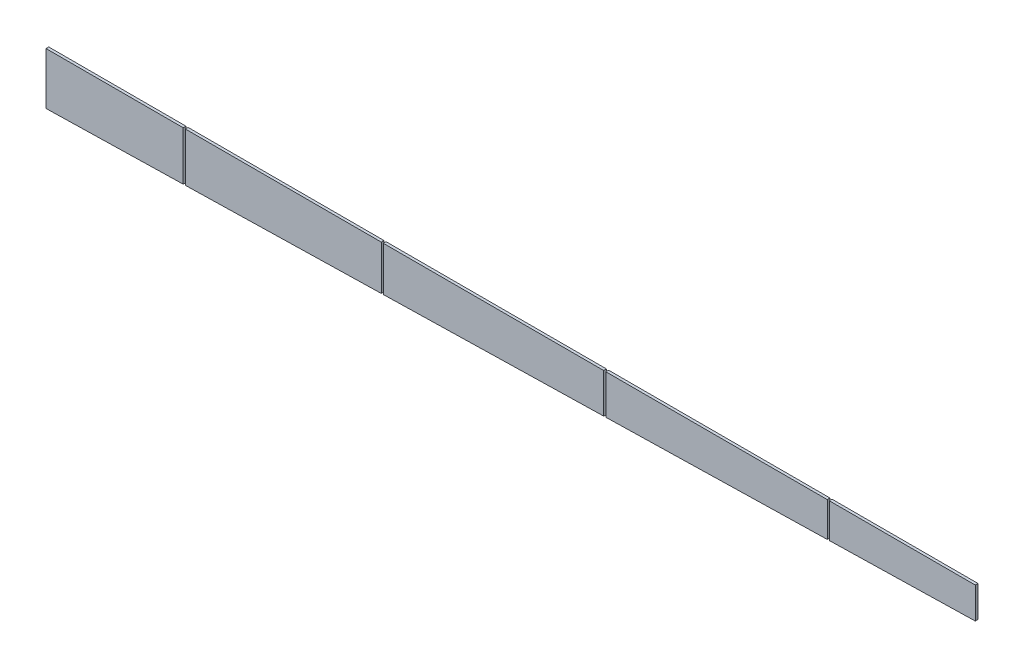
ISO-10303-21;
HEADER;
FILE_DESCRIPTION(('STEP AP214'),'2;1');
FILE_NAME('part.step','',(''),(''),'','','');
FILE_SCHEMA(('AUTOMOTIVE_DESIGN { 1 0 10303 214 1 1 1 1 }'));
ENDSEC;
DATA;
#1=APPLICATION_CONTEXT('core data for automotive mechanical design processes');
#2=APPLICATION_PROTOCOL_DEFINITION('international standard','automotive_design',2000,#1);
#3=PRODUCT_CONTEXT('',#1,'mechanical');
#4=PRODUCT('Part','Part','',(#3));
#5=PRODUCT_RELATED_PRODUCT_CATEGORY('part','',(#4));
#6=PRODUCT_DEFINITION_FORMATION('','',#4);
#7=PRODUCT_DEFINITION_CONTEXT('part definition',#1,'design');
#8=PRODUCT_DEFINITION('design','',#6,#7);
#9=PRODUCT_DEFINITION_SHAPE('','',#8);
#10=(LENGTH_UNIT() NAMED_UNIT(*) SI_UNIT(.MILLI.,.METRE.));
#11=(NAMED_UNIT(*) PLANE_ANGLE_UNIT() SI_UNIT($,.RADIAN.));
#12=(NAMED_UNIT(*) SI_UNIT($,.STERADIAN.) SOLID_ANGLE_UNIT());
#13=UNCERTAINTY_MEASURE_WITH_UNIT(LENGTH_MEASURE(1.E-05),#10,'distance_accuracy_value','');
#14=(GEOMETRIC_REPRESENTATION_CONTEXT(3) GLOBAL_UNCERTAINTY_ASSIGNED_CONTEXT((#13)) GLOBAL_UNIT_ASSIGNED_CONTEXT((#10,
#11,#12)) REPRESENTATION_CONTEXT('',''));
#15=CARTESIAN_POINT('',(0.,0.,0.));
#16=DIRECTION('',(0.,0.,1.));
#17=DIRECTION('',(1.,0.,0.));
#18=AXIS2_PLACEMENT_3D('',#15,#16,#17);
#19=CARTESIAN_POINT('',(1123.74428319064,361.818846768345,2.));
#20=DIRECTION('',(0.,-1.,0.));
#21=DIRECTION('',(0.,0.,-1.));
#22=AXIS2_PLACEMENT_3D('',#19,#20,#21);
#23=PLANE('',#22);
#24=DIRECTION('',(-1.,0.,0.));
#25=VECTOR('',#24,1.);
#26=CARTESIAN_POINT('',(1123.74428319064,361.818846768345,0.));
#27=LINE('',#26,#25);
#28=CARTESIAN_POINT('',(1123.74428319064,361.818846768345,0.));
#29=VERTEX_POINT('',#28);
#30=CARTESIAN_POINT('',(1016.94159784429,361.818846768345,0.));
#31=VERTEX_POINT('',#30);
#32=EDGE_CURVE('E109',#29,#31,#27,.T.);
#33=ORIENTED_EDGE('',*,*,#32,.T.);
#34=DIRECTION('',(0.,0.,-1.));
#35=VECTOR('',#34,1.);
#36=CARTESIAN_POINT('',(1016.94159784429,361.818846768345,2.));
#37=LINE('',#36,#35);
#38=CARTESIAN_POINT('',(1016.94159784429,361.818846768345,2.));
#39=VERTEX_POINT('',#38);
#40=EDGE_CURVE('E12',#39,#31,#37,.T.);
#41=ORIENTED_EDGE('',*,*,#40,.F.);
#42=DIRECTION('',(-1.,0.,0.));
#43=VECTOR('',#42,1.);
#44=CARTESIAN_POINT('',(1123.74428319064,361.818846768345,2.));
#45=LINE('',#44,#43);
#46=CARTESIAN_POINT('',(1123.74428319064,361.818846768345,2.));
#47=VERTEX_POINT('',#46);
#48=EDGE_CURVE('E97',#47,#39,#45,.T.);
#49=ORIENTED_EDGE('',*,*,#48,.F.);
#50=DIRECTION('',(0.,0.,-1.));
#51=VECTOR('',#50,1.);
#52=CARTESIAN_POINT('',(1123.74428319064,361.818846768345,2.));
#53=LINE('',#52,#51);
#54=EDGE_CURVE('E105',#47,#29,#53,.T.);
#55=ORIENTED_EDGE('',*,*,#54,.T.);
#56=EDGE_LOOP('',(#33,#41,#49,#55));
#57=FACE_BOUND('',#56,.T.);
#58=ADVANCED_FACE('F46',(#57),#23,.F.);
#59=CARTESIAN_POINT('',(1016.94159784429,361.818846768345,2.));
#60=DIRECTION('',(1.,0.,0.));
#61=DIRECTION('',(0.,0.,-1.));
#62=AXIS2_PLACEMENT_3D('',#59,#60,#61);
#63=PLANE('',#62);
#64=DIRECTION('',(0.,-1.,0.));
#65=VECTOR('',#64,1.);
#66=CARTESIAN_POINT('',(1016.94159784429,361.818846768345,0.));
#67=LINE('',#66,#65);
#68=CARTESIAN_POINT('',(1016.94159784429,336.598082630978,0.));
#69=VERTEX_POINT('',#68);
#70=EDGE_CURVE('E101',#31,#69,#67,.T.);
#71=ORIENTED_EDGE('',*,*,#70,.T.);
#72=DIRECTION('',(0.,0.,-1.));
#73=VECTOR('',#72,1.);
#74=CARTESIAN_POINT('',(1016.94159784429,336.598082630978,2.));
#75=LINE('',#74,#73);
#76=CARTESIAN_POINT('',(1016.94159784429,336.598082630978,2.));
#77=VERTEX_POINT('',#76);
#78=EDGE_CURVE('E54',#77,#69,#75,.T.);
#79=ORIENTED_EDGE('',*,*,#78,.F.);
#80=DIRECTION('',(0.,-1.,0.));
#81=VECTOR('',#80,1.);
#82=CARTESIAN_POINT('',(1016.94159784429,361.818846768345,2.));
#83=LINE('',#82,#81);
#84=EDGE_CURVE('E92',#39,#77,#83,.T.);
#85=ORIENTED_EDGE('',*,*,#84,.F.);
#86=ORIENTED_EDGE('',*,*,#40,.T.);
#87=EDGE_LOOP('',(#71,#79,#85,#86));
#88=FACE_BOUND('',#87,.T.);
#89=ADVANCED_FACE('F100',(#88),#63,.F.);
#90=CARTESIAN_POINT('',(1016.94159784429,336.598082630978,2.));
#91=DIRECTION('',(-0.0223180913536274,0.999750920378837,0.));
#92=DIRECTION('',(-0.999750920378837,-0.0223180913536274,0.));
#93=AXIS2_PLACEMENT_3D('',#90,#91,#92);
#94=PLANE('',#93);
#95=DIRECTION('',(0.999750920378837,0.0223180913536274,0.));
#96=VECTOR('',#95,1.);
#97=CARTESIAN_POINT('',(1016.94159784429,336.598082630978,0.));
#98=LINE('',#97,#96);
#99=CARTESIAN_POINT('',(1123.74428319064,338.982308581447,0.));
#100=VERTEX_POINT('',#99);
#101=EDGE_CURVE('E79',#69,#100,#98,.T.);
#102=ORIENTED_EDGE('',*,*,#101,.T.);
#103=DIRECTION('',(0.,0.,-1.));
#104=VECTOR('',#103,1.);
#105=CARTESIAN_POINT('',(1123.74428319064,338.982308581447,2.));
#106=LINE('',#105,#104);
#107=CARTESIAN_POINT('',(1123.74428319064,338.982308581447,2.));
#108=VERTEX_POINT('',#107);
#109=EDGE_CURVE('E102',#108,#100,#106,.T.);
#110=ORIENTED_EDGE('',*,*,#109,.F.);
#111=DIRECTION('',(0.999750920378837,0.0223180913536274,0.));
#112=VECTOR('',#111,1.);
#113=CARTESIAN_POINT('',(1016.94159784429,336.598082630978,2.));
#114=LINE('',#113,#112);
#115=EDGE_CURVE('E95',#77,#108,#114,.T.);
#116=ORIENTED_EDGE('',*,*,#115,.F.);
#117=ORIENTED_EDGE('',*,*,#78,.T.);
#118=EDGE_LOOP('',(#102,#110,#116,#117));
#119=FACE_BOUND('',#118,.T.);
#120=ADVANCED_FACE('F103',(#119),#94,.F.);
#121=CARTESIAN_POINT('',(1123.74428319064,338.982308581447,2.));
#122=DIRECTION('',(-1.,0.,0.));
#123=DIRECTION('',(0.,0.,1.));
#124=AXIS2_PLACEMENT_3D('',#121,#122,#123);
#125=PLANE('',#124);
#126=DIRECTION('',(0.,1.,0.));
#127=VECTOR('',#126,1.);
#128=CARTESIAN_POINT('',(1123.74428319064,338.982308581447,0.));
#129=LINE('',#128,#127);
#130=EDGE_CURVE('E85',#100,#29,#129,.T.);
#131=ORIENTED_EDGE('',*,*,#130,.T.);
#132=ORIENTED_EDGE('',*,*,#54,.F.);
#133=DIRECTION('',(0.,1.,0.));
#134=VECTOR('',#133,1.);
#135=CARTESIAN_POINT('',(1123.74428319064,338.982308581447,2.));
#136=LINE('',#135,#134);
#137=EDGE_CURVE('E62',#108,#47,#136,.T.);
#138=ORIENTED_EDGE('',*,*,#137,.F.);
#139=ORIENTED_EDGE('',*,*,#109,.T.);
#140=EDGE_LOOP('',(#131,#132,#138,#139));
#141=FACE_BOUND('',#140,.T.);
#142=ADVANCED_FACE('F116',(#141),#125,.F.);
#143=CARTESIAN_POINT('',(0.,0.,2.));
#144=DIRECTION('',(0.,0.,1.));
#145=DIRECTION('',(1.,0.,0.));
#146=AXIS2_PLACEMENT_3D('',#143,#144,#145);
#147=PLANE('',#146);
#148=ORIENTED_EDGE('',*,*,#48,.T.);
#149=ORIENTED_EDGE('',*,*,#84,.T.);
#150=ORIENTED_EDGE('',*,*,#115,.T.);
#151=ORIENTED_EDGE('',*,*,#137,.T.);
#152=EDGE_LOOP('',(#148,#149,#150,#151));
#153=FACE_BOUND('',#152,.T.);
#154=ADVANCED_FACE('F93',(#153),#147,.T.);
#155=CARTESIAN_POINT('',(0.,0.,0.));
#156=DIRECTION('',(0.,0.,1.));
#157=DIRECTION('',(1.,0.,0.));
#158=AXIS2_PLACEMENT_3D('',#155,#156,#157);
#159=PLANE('',#158);
#160=ORIENTED_EDGE('',*,*,#32,.F.);
#161=ORIENTED_EDGE('',*,*,#130,.F.);
#162=ORIENTED_EDGE('',*,*,#101,.F.);
#163=ORIENTED_EDGE('',*,*,#70,.F.);
#164=EDGE_LOOP('',(#160,#161,#162,#163));
#165=FACE_BOUND('',#164,.T.);
#166=ADVANCED_FACE('F119',(#165),#159,.F.);
#167=CLOSED_SHELL('',(#58,#89,#120,#142,#154,#166));
#168=MANIFOLD_SOLID_BREP('B2',#167);
#169=CARTESIAN_POINT('',(1015.44159784429,361.818846768345,2.));
#170=DIRECTION('',(0.,-1.,0.));
#171=DIRECTION('',(0.,0.,-1.));
#172=AXIS2_PLACEMENT_3D('',#169,#170,#171);
#173=PLANE('',#172);
#174=DIRECTION('',(-1.,0.,0.));
#175=VECTOR('',#174,1.);
#176=CARTESIAN_POINT('',(1015.44159784429,361.818846768345,0.));
#177=LINE('',#176,#175);
#178=CARTESIAN_POINT('',(1015.44159784429,361.818846768345,0.));
#179=VERTEX_POINT('',#178);
#180=CARTESIAN_POINT('',(853.383517511903,361.818846768345,0.));
#181=VERTEX_POINT('',#180);
#182=EDGE_CURVE('E243',#179,#181,#177,.T.);
#183=ORIENTED_EDGE('',*,*,#182,.T.);
#184=DIRECTION('',(0.,0.,-1.));
#185=VECTOR('',#184,1.);
#186=CARTESIAN_POINT('',(853.383517511903,361.818846768345,2.));
#187=LINE('',#186,#185);
#188=CARTESIAN_POINT('',(853.383517511903,361.818846768345,2.));
#189=VERTEX_POINT('',#188);
#190=EDGE_CURVE('E44',#189,#181,#187,.T.);
#191=ORIENTED_EDGE('',*,*,#190,.F.);
#192=DIRECTION('',(-1.,0.,0.));
#193=VECTOR('',#192,1.);
#194=CARTESIAN_POINT('',(1015.44159784429,361.818846768345,2.));
#195=LINE('',#194,#193);
#196=CARTESIAN_POINT('',(1015.44159784429,361.818846768345,2.));
#197=VERTEX_POINT('',#196);
#198=EDGE_CURVE('E231',#197,#189,#195,.T.);
#199=ORIENTED_EDGE('',*,*,#198,.F.);
#200=DIRECTION('',(0.,0.,-1.));
#201=VECTOR('',#200,1.);
#202=CARTESIAN_POINT('',(1015.44159784429,361.818846768345,2.));
#203=LINE('',#202,#201);
#204=EDGE_CURVE('E239',#197,#179,#203,.T.);
#205=ORIENTED_EDGE('',*,*,#204,.T.);
#206=EDGE_LOOP('',(#183,#191,#199,#205));
#207=FACE_BOUND('',#206,.T.);
#208=ADVANCED_FACE('F180',(#207),#173,.F.);
#209=CARTESIAN_POINT('',(853.383517511903,361.818846768345,2.));
#210=DIRECTION('',(1.,0.,0.));
#211=DIRECTION('',(0.,0.,-1.));
#212=AXIS2_PLACEMENT_3D('',#209,#210,#211);
#213=PLANE('',#212);
#214=DIRECTION('',(0.,-1.,0.));
#215=VECTOR('',#214,1.);
#216=CARTESIAN_POINT('',(853.383517511903,361.818846768345,0.));
#217=LINE('',#216,#215);
#218=CARTESIAN_POINT('',(853.383517511903,332.946869009591,0.));
#219=VERTEX_POINT('',#218);
#220=EDGE_CURVE('E235',#181,#219,#217,.T.);
#221=ORIENTED_EDGE('',*,*,#220,.T.);
#222=DIRECTION('',(0.,0.,-1.));
#223=VECTOR('',#222,1.);
#224=CARTESIAN_POINT('',(853.383517511903,332.946869009591,2.));
#225=LINE('',#224,#223);
#226=CARTESIAN_POINT('',(853.383517511903,332.946869009591,2.));
#227=VERTEX_POINT('',#226);
#228=EDGE_CURVE('E188',#227,#219,#225,.T.);
#229=ORIENTED_EDGE('',*,*,#228,.F.);
#230=DIRECTION('',(0.,-1.,0.));
#231=VECTOR('',#230,1.);
#232=CARTESIAN_POINT('',(853.383517511903,361.818846768345,2.));
#233=LINE('',#232,#231);
#234=EDGE_CURVE('E226',#189,#227,#233,.T.);
#235=ORIENTED_EDGE('',*,*,#234,.F.);
#236=ORIENTED_EDGE('',*,*,#190,.T.);
#237=EDGE_LOOP('',(#221,#229,#235,#236));
#238=FACE_BOUND('',#237,.T.);
#239=ADVANCED_FACE('F234',(#238),#213,.F.);
#240=CARTESIAN_POINT('',(853.383517511903,332.946869009591,2.));
#241=DIRECTION('',(-0.0223180913536274,0.999750920378837,0.));
#242=DIRECTION('',(-0.999750920378837,-0.0223180913536274,0.));
#243=AXIS2_PLACEMENT_3D('',#240,#241,#242);
#244=PLANE('',#243);
#245=DIRECTION('',(0.999750920378837,0.0223180913536274,0.));
#246=VECTOR('',#245,1.);
#247=CARTESIAN_POINT('',(853.383517511903,332.946869009591,0.));
#248=LINE('',#247,#246);
#249=CARTESIAN_POINT('',(1015.44159784429,336.564597153398,0.));
#250=VERTEX_POINT('',#249);
#251=EDGE_CURVE('E213',#219,#250,#248,.T.);
#252=ORIENTED_EDGE('',*,*,#251,.T.);
#253=DIRECTION('',(0.,0.,-1.));
#254=VECTOR('',#253,1.);
#255=CARTESIAN_POINT('',(1015.44159784429,336.564597153398,2.));
#256=LINE('',#255,#254);
#257=CARTESIAN_POINT('',(1015.44159784429,336.564597153398,2.));
#258=VERTEX_POINT('',#257);
#259=EDGE_CURVE('E236',#258,#250,#256,.T.);
#260=ORIENTED_EDGE('',*,*,#259,.F.);
#261=DIRECTION('',(0.999750920378837,0.0223180913536274,0.));
#262=VECTOR('',#261,1.);
#263=CARTESIAN_POINT('',(853.383517511903,332.946869009591,2.));
#264=LINE('',#263,#262);
#265=EDGE_CURVE('E229',#227,#258,#264,.T.);
#266=ORIENTED_EDGE('',*,*,#265,.F.);
#267=ORIENTED_EDGE('',*,*,#228,.T.);
#268=EDGE_LOOP('',(#252,#260,#266,#267));
#269=FACE_BOUND('',#268,.T.);
#270=ADVANCED_FACE('F237',(#269),#244,.F.);
#271=CARTESIAN_POINT('',(1015.44159784429,336.564597153398,2.));
#272=DIRECTION('',(-1.,0.,0.));
#273=DIRECTION('',(0.,0.,1.));
#274=AXIS2_PLACEMENT_3D('',#271,#272,#273);
#275=PLANE('',#274);
#276=DIRECTION('',(0.,1.,0.));
#277=VECTOR('',#276,1.);
#278=CARTESIAN_POINT('',(1015.44159784429,336.564597153398,0.));
#279=LINE('',#278,#277);
#280=EDGE_CURVE('E219',#250,#179,#279,.T.);
#281=ORIENTED_EDGE('',*,*,#280,.T.);
#282=ORIENTED_EDGE('',*,*,#204,.F.);
#283=DIRECTION('',(0.,1.,0.));
#284=VECTOR('',#283,1.);
#285=CARTESIAN_POINT('',(1015.44159784429,336.564597153398,2.));
#286=LINE('',#285,#284);
#287=EDGE_CURVE('E196',#258,#197,#286,.T.);
#288=ORIENTED_EDGE('',*,*,#287,.F.);
#289=ORIENTED_EDGE('',*,*,#259,.T.);
#290=EDGE_LOOP('',(#281,#282,#288,#289));
#291=FACE_BOUND('',#290,.T.);
#292=ADVANCED_FACE('F250',(#291),#275,.F.);
#293=CARTESIAN_POINT('',(0.,0.,2.));
#294=DIRECTION('',(0.,0.,1.));
#295=DIRECTION('',(1.,0.,0.));
#296=AXIS2_PLACEMENT_3D('',#293,#294,#295);
#297=PLANE('',#296);
#298=ORIENTED_EDGE('',*,*,#198,.T.);
#299=ORIENTED_EDGE('',*,*,#234,.T.);
#300=ORIENTED_EDGE('',*,*,#265,.T.);
#301=ORIENTED_EDGE('',*,*,#287,.T.);
#302=EDGE_LOOP('',(#298,#299,#300,#301));
#303=FACE_BOUND('',#302,.T.);
#304=ADVANCED_FACE('F227',(#303),#297,.T.);
#305=CARTESIAN_POINT('',(0.,0.,0.));
#306=DIRECTION('',(0.,0.,1.));
#307=DIRECTION('',(1.,0.,0.));
#308=AXIS2_PLACEMENT_3D('',#305,#306,#307);
#309=PLANE('',#308);
#310=ORIENTED_EDGE('',*,*,#182,.F.);
#311=ORIENTED_EDGE('',*,*,#280,.F.);
#312=ORIENTED_EDGE('',*,*,#251,.F.);
#313=ORIENTED_EDGE('',*,*,#220,.F.);
#314=EDGE_LOOP('',(#310,#311,#312,#313));
#315=FACE_BOUND('',#314,.T.);
#316=ADVANCED_FACE('F253',(#315),#309,.F.);
#317=CLOSED_SHELL('',(#208,#239,#270,#292,#304,#316));
#318=MANIFOLD_SOLID_BREP('B6',#317);
#319=CARTESIAN_POINT('',(851.883517511903,361.818846768345,2.));
#320=DIRECTION('',(0.,-1.,0.));
#321=DIRECTION('',(0.,0.,-1.));
#322=AXIS2_PLACEMENT_3D('',#319,#320,#321);
#323=PLANE('',#322);
#324=DIRECTION('',(-1.,0.,0.));
#325=VECTOR('',#324,1.);
#326=CARTESIAN_POINT('',(851.883517511903,361.818846768345,0.));
#327=LINE('',#326,#325);
#328=CARTESIAN_POINT('',(851.883517511903,361.818846768345,0.));
#329=VERTEX_POINT('',#328);
#330=CARTESIAN_POINT('',(690.606151826268,361.818846768345,0.));
#331=VERTEX_POINT('',#330);
#332=EDGE_CURVE('E377',#329,#331,#327,.T.);
#333=ORIENTED_EDGE('',*,*,#332,.T.);
#334=DIRECTION('',(0.,0.,-1.));
#335=VECTOR('',#334,1.);
#336=CARTESIAN_POINT('',(690.606151826268,361.818846768345,2.));
#337=LINE('',#336,#335);
#338=CARTESIAN_POINT('',(690.606151826268,361.818846768345,2.));
#339=VERTEX_POINT('',#338);
#340=EDGE_CURVE('E178',#339,#331,#337,.T.);
#341=ORIENTED_EDGE('',*,*,#340,.F.);
#342=DIRECTION('',(-1.,0.,0.));
#343=VECTOR('',#342,1.);
#344=CARTESIAN_POINT('',(851.883517511903,361.818846768345,2.));
#345=LINE('',#344,#343);
#346=CARTESIAN_POINT('',(851.883517511903,361.818846768345,2.));
#347=VERTEX_POINT('',#346);
#348=EDGE_CURVE('E365',#347,#339,#345,.T.);
#349=ORIENTED_EDGE('',*,*,#348,.F.);
#350=DIRECTION('',(0.,0.,-1.));
#351=VECTOR('',#350,1.);
#352=CARTESIAN_POINT('',(851.883517511903,361.818846768345,2.));
#353=LINE('',#352,#351);
#354=EDGE_CURVE('E373',#347,#329,#353,.T.);
#355=ORIENTED_EDGE('',*,*,#354,.T.);
#356=EDGE_LOOP('',(#333,#341,#349,#355));
#357=FACE_BOUND('',#356,.T.);
#358=ADVANCED_FACE('F314',(#357),#323,.F.);
#359=CARTESIAN_POINT('',(690.606151826268,361.818846768345,2.));
#360=DIRECTION('',(1.,0.,0.));
#361=DIRECTION('',(0.,0.,-1.));
#362=AXIS2_PLACEMENT_3D('',#359,#360,#361);
#363=PLANE('',#362);
#364=DIRECTION('',(0.,-1.,0.));
#365=VECTOR('',#364,1.);
#366=CARTESIAN_POINT('',(690.606151826268,361.818846768345,0.));
#367=LINE('',#366,#365);
#368=CARTESIAN_POINT('',(690.606151826268,329.31308379007,0.));
#369=VERTEX_POINT('',#368);
#370=EDGE_CURVE('E369',#331,#369,#367,.T.);
#371=ORIENTED_EDGE('',*,*,#370,.T.);
#372=DIRECTION('',(0.,0.,-1.));
#373=VECTOR('',#372,1.);
#374=CARTESIAN_POINT('',(690.606151826268,329.31308379007,2.));
#375=LINE('',#374,#373);
#376=CARTESIAN_POINT('',(690.606151826268,329.31308379007,2.));
#377=VERTEX_POINT('',#376);
#378=EDGE_CURVE('E322',#377,#369,#375,.T.);
#379=ORIENTED_EDGE('',*,*,#378,.F.);
#380=DIRECTION('',(0.,-1.,0.));
#381=VECTOR('',#380,1.);
#382=CARTESIAN_POINT('',(690.606151826268,361.818846768345,2.));
#383=LINE('',#382,#381);
#384=EDGE_CURVE('E360',#339,#377,#383,.T.);
#385=ORIENTED_EDGE('',*,*,#384,.F.);
#386=ORIENTED_EDGE('',*,*,#340,.T.);
#387=EDGE_LOOP('',(#371,#379,#385,#386));
#388=FACE_BOUND('',#387,.T.);
#389=ADVANCED_FACE('F368',(#388),#363,.F.);
#390=CARTESIAN_POINT('',(690.606151826268,329.31308379007,2.));
#391=DIRECTION('',(-0.0223180913536276,0.999750920378837,0.));
#392=DIRECTION('',(-0.999750920378837,-0.0223180913536276,0.));
#393=AXIS2_PLACEMENT_3D('',#390,#391,#392);
#394=PLANE('',#393);
#395=DIRECTION('',(0.999750920378837,0.0223180913536276,0.));
#396=VECTOR('',#395,1.);
#397=CARTESIAN_POINT('',(690.606151826268,329.31308379007,0.));
#398=LINE('',#397,#396);
#399=CARTESIAN_POINT('',(851.883517511903,332.91338353201,0.));
#400=VERTEX_POINT('',#399);
#401=EDGE_CURVE('E347',#369,#400,#398,.T.);
#402=ORIENTED_EDGE('',*,*,#401,.T.);
#403=DIRECTION('',(0.,0.,-1.));
#404=VECTOR('',#403,1.);
#405=CARTESIAN_POINT('',(851.883517511903,332.91338353201,2.));
#406=LINE('',#405,#404);
#407=CARTESIAN_POINT('',(851.883517511903,332.91338353201,2.));
#408=VERTEX_POINT('',#407);
#409=EDGE_CURVE('E370',#408,#400,#406,.T.);
#410=ORIENTED_EDGE('',*,*,#409,.F.);
#411=DIRECTION('',(0.999750920378837,0.0223180913536276,0.));
#412=VECTOR('',#411,1.);
#413=CARTESIAN_POINT('',(690.606151826268,329.31308379007,2.));
#414=LINE('',#413,#412);
#415=EDGE_CURVE('E363',#377,#408,#414,.T.);
#416=ORIENTED_EDGE('',*,*,#415,.F.);
#417=ORIENTED_EDGE('',*,*,#378,.T.);
#418=EDGE_LOOP('',(#402,#410,#416,#417));
#419=FACE_BOUND('',#418,.T.);
#420=ADVANCED_FACE('F371',(#419),#394,.F.);
#421=CARTESIAN_POINT('',(851.883517511903,332.91338353201,2.));
#422=DIRECTION('',(-1.,0.,0.));
#423=DIRECTION('',(0.,0.,1.));
#424=AXIS2_PLACEMENT_3D('',#421,#422,#423);
#425=PLANE('',#424);
#426=DIRECTION('',(0.,1.,0.));
#427=VECTOR('',#426,1.);
#428=CARTESIAN_POINT('',(851.883517511903,332.91338353201,0.));
#429=LINE('',#428,#427);
#430=EDGE_CURVE('E353',#400,#329,#429,.T.);
#431=ORIENTED_EDGE('',*,*,#430,.T.);
#432=ORIENTED_EDGE('',*,*,#354,.F.);
#433=DIRECTION('',(0.,1.,0.));
#434=VECTOR('',#433,1.);
#435=CARTESIAN_POINT('',(851.883517511903,332.91338353201,2.));
#436=LINE('',#435,#434);
#437=EDGE_CURVE('E330',#408,#347,#436,.T.);
#438=ORIENTED_EDGE('',*,*,#437,.F.);
#439=ORIENTED_EDGE('',*,*,#409,.T.);
#440=EDGE_LOOP('',(#431,#432,#438,#439));
#441=FACE_BOUND('',#440,.T.);
#442=ADVANCED_FACE('F384',(#441),#425,.F.);
#443=CARTESIAN_POINT('',(0.,0.,2.));
#444=DIRECTION('',(0.,0.,1.));
#445=DIRECTION('',(1.,0.,0.));
#446=AXIS2_PLACEMENT_3D('',#443,#444,#445);
#447=PLANE('',#446);
#448=ORIENTED_EDGE('',*,*,#348,.T.);
#449=ORIENTED_EDGE('',*,*,#384,.T.);
#450=ORIENTED_EDGE('',*,*,#415,.T.);
#451=ORIENTED_EDGE('',*,*,#437,.T.);
#452=EDGE_LOOP('',(#448,#449,#450,#451));
#453=FACE_BOUND('',#452,.T.);
#454=ADVANCED_FACE('F361',(#453),#447,.T.);
#455=CARTESIAN_POINT('',(0.,0.,0.));
#456=DIRECTION('',(0.,0.,1.));
#457=DIRECTION('',(1.,0.,0.));
#458=AXIS2_PLACEMENT_3D('',#455,#456,#457);
#459=PLANE('',#458);
#460=ORIENTED_EDGE('',*,*,#332,.F.);
#461=ORIENTED_EDGE('',*,*,#430,.F.);
#462=ORIENTED_EDGE('',*,*,#401,.F.);
#463=ORIENTED_EDGE('',*,*,#370,.F.);
#464=EDGE_LOOP('',(#460,#461,#462,#463));
#465=FACE_BOUND('',#464,.T.);
#466=ADVANCED_FACE('F387',(#465),#459,.F.);
#467=CLOSED_SHELL('',(#358,#389,#420,#442,#454,#466));
#468=MANIFOLD_SOLID_BREP('B38',#467);
#469=CARTESIAN_POINT('',(689.106151826268,361.818846768345,2.));
#470=DIRECTION('',(0.,-1.,0.));
#471=DIRECTION('',(0.,0.,-1.));
#472=AXIS2_PLACEMENT_3D('',#469,#470,#471);
#473=PLANE('',#472);
#474=DIRECTION('',(-1.,0.,0.));
#475=VECTOR('',#474,1.);
#476=CARTESIAN_POINT('',(689.106151826268,361.818846768345,0.));
#477=LINE('',#476,#475);
#478=CARTESIAN_POINT('',(689.106151826268,361.818846768345,0.));
#479=VERTEX_POINT('',#478);
#480=CARTESIAN_POINT('',(545.702532921128,361.818846768345,0.));
#481=VERTEX_POINT('',#480);
#482=EDGE_CURVE('E510',#479,#481,#477,.T.);
#483=ORIENTED_EDGE('',*,*,#482,.T.);
#484=DIRECTION('',(0.,0.,-1.));
#485=VECTOR('',#484,1.);
#486=CARTESIAN_POINT('',(545.702532921128,361.818846768345,2.));
#487=LINE('',#486,#485);
#488=CARTESIAN_POINT('',(545.702532921128,361.818846768345,2.));
#489=VERTEX_POINT('',#488);
#490=EDGE_CURVE('E312',#489,#481,#487,.T.);
#491=ORIENTED_EDGE('',*,*,#490,.F.);
#492=DIRECTION('',(-1.,0.,0.));
#493=VECTOR('',#492,1.);
#494=CARTESIAN_POINT('',(689.106151826268,361.818846768345,2.));
#495=LINE('',#494,#493);
#496=CARTESIAN_POINT('',(689.106151826268,361.818846768345,2.));
#497=VERTEX_POINT('',#496);
#498=EDGE_CURVE('E498',#497,#489,#495,.T.);
#499=ORIENTED_EDGE('',*,*,#498,.F.);
#500=DIRECTION('',(0.,0.,-1.));
#501=VECTOR('',#500,1.);
#502=CARTESIAN_POINT('',(689.106151826268,361.818846768345,2.));
#503=LINE('',#502,#501);
#504=EDGE_CURVE('E506',#497,#479,#503,.T.);
#505=ORIENTED_EDGE('',*,*,#504,.T.);
#506=EDGE_LOOP('',(#483,#491,#499,#505));
#507=FACE_BOUND('',#506,.T.);
#508=ADVANCED_FACE('F447',(#507),#473,.F.);
#509=CARTESIAN_POINT('',(545.702532921128,361.818846768345,2.));
#510=DIRECTION('',(1.,0.,0.));
#511=DIRECTION('',(0.,0.,-1.));
#512=AXIS2_PLACEMENT_3D('',#509,#510,#511);
#513=PLANE('',#512);
#514=DIRECTION('',(0.,-1.,0.));
#515=VECTOR('',#514,1.);
#516=CARTESIAN_POINT('',(545.702532921128,361.818846768345,0.));
#517=LINE('',#516,#515);
#518=CARTESIAN_POINT('',(545.702532921128,326.078305868615,0.));
#519=VERTEX_POINT('',#518);
#520=EDGE_CURVE('E502',#481,#519,#517,.T.);
#521=ORIENTED_EDGE('',*,*,#520,.T.);
#522=DIRECTION('',(0.,0.,-1.));
#523=VECTOR('',#522,1.);
#524=CARTESIAN_POINT('',(545.702532921128,326.078305868615,2.));
#525=LINE('',#524,#523);
#526=CARTESIAN_POINT('',(545.702532921128,326.078305868615,2.));
#527=VERTEX_POINT('',#526);
#528=EDGE_CURVE('E455',#527,#519,#525,.T.);
#529=ORIENTED_EDGE('',*,*,#528,.F.);
#530=DIRECTION('',(0.,-1.,0.));
#531=VECTOR('',#530,1.);
#532=CARTESIAN_POINT('',(545.702532921128,361.818846768345,2.));
#533=LINE('',#532,#531);
#534=EDGE_CURVE('E493',#489,#527,#533,.T.);
#535=ORIENTED_EDGE('',*,*,#534,.F.);
#536=ORIENTED_EDGE('',*,*,#490,.T.);
#537=EDGE_LOOP('',(#521,#529,#535,#536));
#538=FACE_BOUND('',#537,.T.);
#539=ADVANCED_FACE('F501',(#538),#513,.F.);
#540=CARTESIAN_POINT('',(545.702532921128,326.078305868615,2.));
#541=DIRECTION('',(-0.022318091353627,0.999750920378837,0.));
#542=DIRECTION('',(-0.999750920378837,-0.022318091353627,0.));
#543=AXIS2_PLACEMENT_3D('',#540,#541,#542);
#544=PLANE('',#543);
#545=DIRECTION('',(0.999750920378837,0.022318091353627,0.));
#546=VECTOR('',#545,1.);
#547=CARTESIAN_POINT('',(545.702532921128,326.078305868615,0.));
#548=LINE('',#547,#546);
#549=CARTESIAN_POINT('',(689.106151826268,329.279598312489,0.));
#550=VERTEX_POINT('',#549);
#551=EDGE_CURVE('E480',#519,#550,#548,.T.);
#552=ORIENTED_EDGE('',*,*,#551,.T.);
#553=DIRECTION('',(0.,0.,-1.));
#554=VECTOR('',#553,1.);
#555=CARTESIAN_POINT('',(689.106151826268,329.279598312489,2.));
#556=LINE('',#555,#554);
#557=CARTESIAN_POINT('',(689.106151826268,329.279598312489,2.));
#558=VERTEX_POINT('',#557);
#559=EDGE_CURVE('E503',#558,#550,#556,.T.);
#560=ORIENTED_EDGE('',*,*,#559,.F.);
#561=DIRECTION('',(0.999750920378837,0.022318091353627,0.));
#562=VECTOR('',#561,1.);
#563=CARTESIAN_POINT('',(545.702532921128,326.078305868615,2.));
#564=LINE('',#563,#562);
#565=EDGE_CURVE('E496',#527,#558,#564,.T.);
#566=ORIENTED_EDGE('',*,*,#565,.F.);
#567=ORIENTED_EDGE('',*,*,#528,.T.);
#568=EDGE_LOOP('',(#552,#560,#566,#567));
#569=FACE_BOUND('',#568,.T.);
#570=ADVANCED_FACE('F504',(#569),#544,.F.);
#571=CARTESIAN_POINT('',(689.106151826268,329.279598312489,2.));
#572=DIRECTION('',(-1.,0.,0.));
#573=DIRECTION('',(0.,0.,1.));
#574=AXIS2_PLACEMENT_3D('',#571,#572,#573);
#575=PLANE('',#574);
#576=DIRECTION('',(0.,1.,0.));
#577=VECTOR('',#576,1.);
#578=CARTESIAN_POINT('',(689.106151826268,329.279598312489,0.));
#579=LINE('',#578,#577);
#580=EDGE_CURVE('E486',#550,#479,#579,.T.);
#581=ORIENTED_EDGE('',*,*,#580,.T.);
#582=ORIENTED_EDGE('',*,*,#504,.F.);
#583=DIRECTION('',(0.,1.,0.));
#584=VECTOR('',#583,1.);
#585=CARTESIAN_POINT('',(689.106151826268,329.279598312489,2.));
#586=LINE('',#585,#584);
#587=EDGE_CURVE('E463',#558,#497,#586,.T.);
#588=ORIENTED_EDGE('',*,*,#587,.F.);
#589=ORIENTED_EDGE('',*,*,#559,.T.);
#590=EDGE_LOOP('',(#581,#582,#588,#589));
#591=FACE_BOUND('',#590,.T.);
#592=ADVANCED_FACE('F517',(#591),#575,.F.);
#593=CARTESIAN_POINT('',(0.,0.,2.));
#594=DIRECTION('',(0.,0.,1.));
#595=DIRECTION('',(1.,0.,0.));
#596=AXIS2_PLACEMENT_3D('',#593,#594,#595);
#597=PLANE('',#596);
#598=ORIENTED_EDGE('',*,*,#498,.T.);
#599=ORIENTED_EDGE('',*,*,#534,.T.);
#600=ORIENTED_EDGE('',*,*,#565,.T.);
#601=ORIENTED_EDGE('',*,*,#587,.T.);
#602=EDGE_LOOP('',(#598,#599,#600,#601));
#603=FACE_BOUND('',#602,.T.);
#604=ADVANCED_FACE('F494',(#603),#597,.T.);
#605=CARTESIAN_POINT('',(0.,0.,0.));
#606=DIRECTION('',(0.,0.,1.));
#607=DIRECTION('',(1.,0.,0.));
#608=AXIS2_PLACEMENT_3D('',#605,#606,#607);
#609=PLANE('',#608);
#610=ORIENTED_EDGE('',*,*,#482,.F.);
#611=ORIENTED_EDGE('',*,*,#580,.F.);
#612=ORIENTED_EDGE('',*,*,#551,.F.);
#613=ORIENTED_EDGE('',*,*,#520,.F.);
#614=EDGE_LOOP('',(#610,#611,#612,#613));
#615=FACE_BOUND('',#614,.T.);
#616=ADVANCED_FACE('F520',(#615),#609,.F.);
#617=CLOSED_SHELL('',(#508,#539,#570,#592,#604,#616));
#618=MANIFOLD_SOLID_BREP('B172',#617);
#619=CARTESIAN_POINT('',(544.202532921128,361.818846768345,2.));
#620=DIRECTION('',(0.,-1.,0.));
#621=DIRECTION('',(0.,0.,-1.));
#622=AXIS2_PLACEMENT_3D('',#619,#620,#621);
#623=PLANE('',#622);
#624=DIRECTION('',(-1.,0.,0.));
#625=VECTOR('',#624,1.);
#626=CARTESIAN_POINT('',(544.202532921128,361.818846768345,0.));
#627=LINE('',#626,#625);
#628=CARTESIAN_POINT('',(544.202532921128,361.818846768345,0.));
#629=VERTEX_POINT('',#628);
#630=CARTESIAN_POINT('',(443.787377050632,361.818846768345,0.));
#631=VERTEX_POINT('',#630);
#632=EDGE_CURVE('E634',#629,#631,#627,.T.);
#633=ORIENTED_EDGE('',*,*,#632,.T.);
#634=DIRECTION('',(0.,0.,-1.));
#635=VECTOR('',#634,1.);
#636=CARTESIAN_POINT('',(443.787377050632,361.818846768345,2.));
#637=LINE('',#636,#635);
#638=CARTESIAN_POINT('',(443.787377050632,361.818846768345,2.));
#639=VERTEX_POINT('',#638);
#640=EDGE_CURVE('E445',#639,#631,#637,.T.);
#641=ORIENTED_EDGE('',*,*,#640,.F.);
#642=DIRECTION('',(-1.,0.,0.));
#643=VECTOR('',#642,1.);
#644=CARTESIAN_POINT('',(544.202532921128,361.818846768345,2.));
#645=LINE('',#644,#643);
#646=CARTESIAN_POINT('',(544.202532921128,361.818846768345,2.));
#647=VERTEX_POINT('',#646);
#648=EDGE_CURVE('E622',#647,#639,#645,.T.);
#649=ORIENTED_EDGE('',*,*,#648,.F.);
#650=DIRECTION('',(0.,0.,-1.));
#651=VECTOR('',#650,1.);
#652=CARTESIAN_POINT('',(544.202532921128,361.818846768345,2.));
#653=LINE('',#652,#651);
#654=EDGE_CURVE('E630',#647,#629,#653,.T.);
#655=ORIENTED_EDGE('',*,*,#654,.T.);
#656=EDGE_LOOP('',(#633,#641,#649,#655));
#657=FACE_BOUND('',#656,.T.);
#658=ADVANCED_FACE('F571',(#657),#623,.F.);
#659=CARTESIAN_POINT('',(443.787377050632,361.818846768345,2.));
#660=DIRECTION('',(1.,0.,0.));
#661=DIRECTION('',(0.,0.,-1.));
#662=AXIS2_PLACEMENT_3D('',#659,#660,#661);
#663=PLANE('',#662);
#664=DIRECTION('',(0.,-1.,0.));
#665=VECTOR('',#664,1.);
#666=CARTESIAN_POINT('',(443.787377050632,361.818846768345,0.));
#667=LINE('',#666,#665);
#668=CARTESIAN_POINT('',(443.787377050632,323.803187423937,0.));
#669=VERTEX_POINT('',#668);
#670=EDGE_CURVE('E626',#631,#669,#667,.T.);
#671=ORIENTED_EDGE('',*,*,#670,.T.);
#672=DIRECTION('',(0.,0.,-1.));
#673=VECTOR('',#672,1.);
#674=CARTESIAN_POINT('',(443.787377050632,323.803187423937,2.));
#675=LINE('',#674,#673);
#676=CARTESIAN_POINT('',(443.787377050632,323.803187423937,2.));
#677=VERTEX_POINT('',#676);
#678=EDGE_CURVE('E579',#677,#669,#675,.T.);
#679=ORIENTED_EDGE('',*,*,#678,.F.);
#680=DIRECTION('',(0.,-1.,0.));
#681=VECTOR('',#680,1.);
#682=CARTESIAN_POINT('',(443.787377050632,361.818846768345,2.));
#683=LINE('',#682,#681);
#684=EDGE_CURVE('E617',#639,#677,#683,.T.);
#685=ORIENTED_EDGE('',*,*,#684,.F.);
#686=ORIENTED_EDGE('',*,*,#640,.T.);
#687=EDGE_LOOP('',(#671,#679,#685,#686));
#688=FACE_BOUND('',#687,.T.);
#689=ADVANCED_FACE('F625',(#688),#663,.F.);
#690=CARTESIAN_POINT('',(443.787377050632,323.803187423937,2.));
#691=DIRECTION('',(-0.0223180913536271,0.999750920378837,0.));
#692=DIRECTION('',(-0.999750920378837,-0.0223180913536271,0.));
#693=AXIS2_PLACEMENT_3D('',#690,#691,#692);
#694=PLANE('',#693);
#695=DIRECTION('',(0.999750920378837,0.0223180913536271,0.));
#696=VECTOR('',#695,1.);
#697=CARTESIAN_POINT('',(443.787377050632,323.803187423937,0.));
#698=LINE('',#697,#696);
#699=CARTESIAN_POINT('',(544.202532921128,326.044820391034,0.));
#700=VERTEX_POINT('',#699);
#701=EDGE_CURVE('E604',#669,#700,#698,.T.);
#702=ORIENTED_EDGE('',*,*,#701,.T.);
#703=DIRECTION('',(0.,0.,-1.));
#704=VECTOR('',#703,1.);
#705=CARTESIAN_POINT('',(544.202532921128,326.044820391034,2.));
#706=LINE('',#705,#704);
#707=CARTESIAN_POINT('',(544.202532921128,326.044820391034,2.));
#708=VERTEX_POINT('',#707);
#709=EDGE_CURVE('E627',#708,#700,#706,.T.);
#710=ORIENTED_EDGE('',*,*,#709,.F.);
#711=DIRECTION('',(0.999750920378837,0.0223180913536271,0.));
#712=VECTOR('',#711,1.);
#713=CARTESIAN_POINT('',(443.787377050632,323.803187423937,2.));
#714=LINE('',#713,#712);
#715=EDGE_CURVE('E620',#677,#708,#714,.T.);
#716=ORIENTED_EDGE('',*,*,#715,.F.);
#717=ORIENTED_EDGE('',*,*,#678,.T.);
#718=EDGE_LOOP('',(#702,#710,#716,#717));
#719=FACE_BOUND('',#718,.T.);
#720=ADVANCED_FACE('F628',(#719),#694,.F.);
#721=CARTESIAN_POINT('',(544.202532921128,326.044820391034,2.));
#722=DIRECTION('',(-1.,0.,0.));
#723=DIRECTION('',(0.,0.,1.));
#724=AXIS2_PLACEMENT_3D('',#721,#722,#723);
#725=PLANE('',#724);
#726=DIRECTION('',(0.,1.,0.));
#727=VECTOR('',#726,1.);
#728=CARTESIAN_POINT('',(544.202532921128,326.044820391034,0.));
#729=LINE('',#728,#727);
#730=EDGE_CURVE('E610',#700,#629,#729,.T.);
#731=ORIENTED_EDGE('',*,*,#730,.T.);
#732=ORIENTED_EDGE('',*,*,#654,.F.);
#733=DIRECTION('',(0.,1.,0.));
#734=VECTOR('',#733,1.);
#735=CARTESIAN_POINT('',(544.202532921128,326.044820391034,2.));
#736=LINE('',#735,#734);
#737=EDGE_CURVE('E587',#708,#647,#736,.T.);
#738=ORIENTED_EDGE('',*,*,#737,.F.);
#739=ORIENTED_EDGE('',*,*,#709,.T.);
#740=EDGE_LOOP('',(#731,#732,#738,#739));
#741=FACE_BOUND('',#740,.T.);
#742=ADVANCED_FACE('F641',(#741),#725,.F.);
#743=CARTESIAN_POINT('',(0.,0.,2.));
#744=DIRECTION('',(0.,0.,1.));
#745=DIRECTION('',(1.,0.,0.));
#746=AXIS2_PLACEMENT_3D('',#743,#744,#745);
#747=PLANE('',#746);
#748=ORIENTED_EDGE('',*,*,#648,.T.);
#749=ORIENTED_EDGE('',*,*,#684,.T.);
#750=ORIENTED_EDGE('',*,*,#715,.T.);
#751=ORIENTED_EDGE('',*,*,#737,.T.);
#752=EDGE_LOOP('',(#748,#749,#750,#751));
#753=FACE_BOUND('',#752,.T.);
#754=ADVANCED_FACE('F618',(#753),#747,.T.);
#755=CARTESIAN_POINT('',(0.,0.,0.));
#756=DIRECTION('',(0.,0.,1.));
#757=DIRECTION('',(1.,0.,0.));
#758=AXIS2_PLACEMENT_3D('',#755,#756,#757);
#759=PLANE('',#758);
#760=ORIENTED_EDGE('',*,*,#632,.F.);
#761=ORIENTED_EDGE('',*,*,#730,.F.);
#762=ORIENTED_EDGE('',*,*,#701,.F.);
#763=ORIENTED_EDGE('',*,*,#670,.F.);
#764=EDGE_LOOP('',(#760,#761,#762,#763));
#765=FACE_BOUND('',#764,.T.);
#766=ADVANCED_FACE('F644',(#765),#759,.F.);
#767=CLOSED_SHELL('',(#658,#689,#720,#742,#754,#766));
#768=MANIFOLD_SOLID_BREP('B306',#767);
#769=ADVANCED_BREP_SHAPE_REPRESENTATION('',(#18,#168,#318,#468,#618,#768),#14);
#770=SHAPE_DEFINITION_REPRESENTATION(#9,#769);
ENDSEC;
END-ISO-10303-21;
